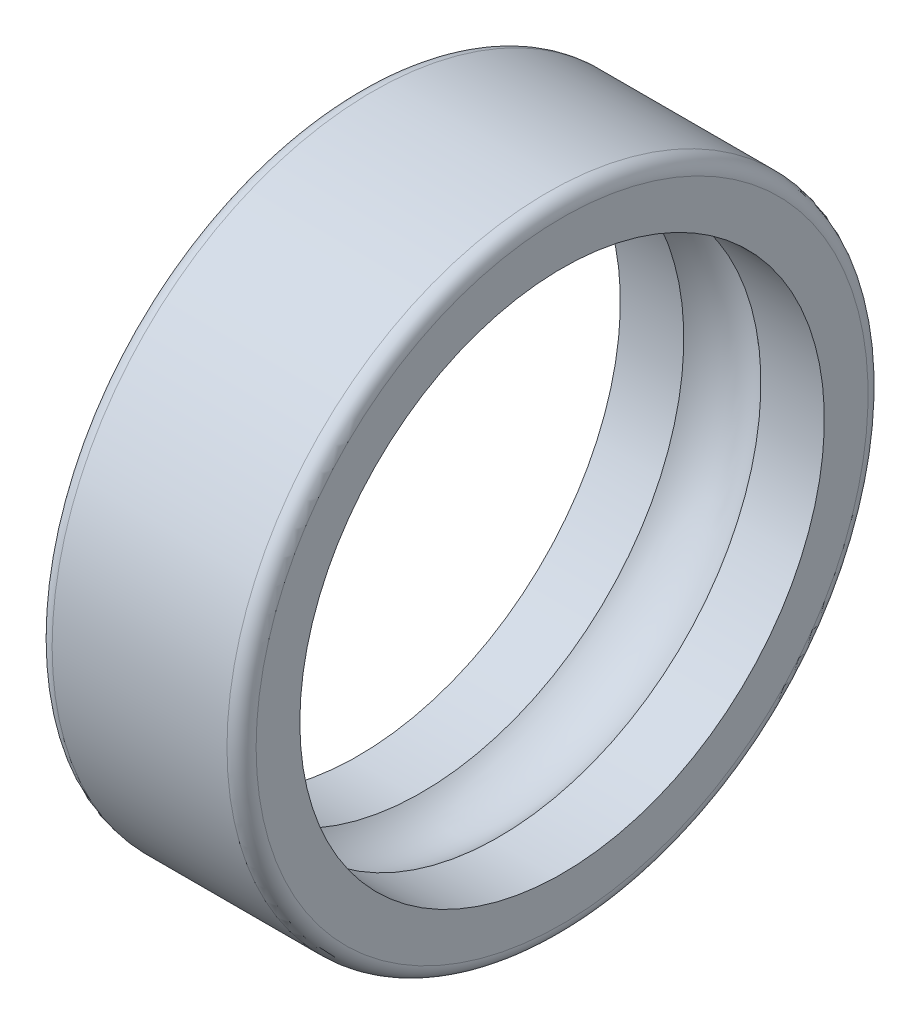
ISO-10303-21;
HEADER;
FILE_DESCRIPTION(('STEP AP214'),'2;1');
FILE_NAME('part.step','',(''),(''),'','','');
FILE_SCHEMA(('AUTOMOTIVE_DESIGN { 1 0 10303 214 1 1 1 1 }'));
ENDSEC;
DATA;
#1=APPLICATION_CONTEXT('core data for automotive mechanical design processes');
#2=APPLICATION_PROTOCOL_DEFINITION('international standard','automotive_design',2000,#1);
#3=PRODUCT_CONTEXT('',#1,'mechanical');
#4=PRODUCT('Part','Part','',(#3));
#5=PRODUCT_RELATED_PRODUCT_CATEGORY('part','',(#4));
#6=PRODUCT_DEFINITION_FORMATION('','',#4);
#7=PRODUCT_DEFINITION_CONTEXT('part definition',#1,'design');
#8=PRODUCT_DEFINITION('design','',#6,#7);
#9=PRODUCT_DEFINITION_SHAPE('','',#8);
#10=(LENGTH_UNIT() NAMED_UNIT(*) SI_UNIT(.MILLI.,.METRE.));
#11=(NAMED_UNIT(*) PLANE_ANGLE_UNIT() SI_UNIT($,.RADIAN.));
#12=(NAMED_UNIT(*) SI_UNIT($,.STERADIAN.) SOLID_ANGLE_UNIT());
#13=UNCERTAINTY_MEASURE_WITH_UNIT(LENGTH_MEASURE(1.E-05),#10,'distance_accuracy_value','');
#14=(GEOMETRIC_REPRESENTATION_CONTEXT(3) GLOBAL_UNCERTAINTY_ASSIGNED_CONTEXT((#13)) GLOBAL_UNIT_ASSIGNED_CONTEXT((#10,
#11,#12)) REPRESENTATION_CONTEXT('',''));
#15=CARTESIAN_POINT('',(0.,0.,0.));
#16=DIRECTION('',(0.,0.,1.));
#17=DIRECTION('',(1.,0.,0.));
#18=AXIS2_PLACEMENT_3D('',#15,#16,#17);
#19=CARTESIAN_POINT('',(0.,0.,0.));
#20=DIRECTION('',(-1.,0.,0.));
#21=DIRECTION('',(0.,0.,1.));
#22=AXIS2_PLACEMENT_3D('',#19,#20,#21);
#23=CYLINDRICAL_SURFACE('',#22,9.);
#24=CARTESIAN_POINT('',(3.5,0.,0.));
#25=DIRECTION('',(-1.,0.,0.));
#26=DIRECTION('',(0.,0.,1.));
#27=AXIS2_PLACEMENT_3D('',#24,#25,#26);
#28=CIRCLE('',#27,9.);
#29=CARTESIAN_POINT('',(3.5,0.,9.));
#30=VERTEX_POINT('',#29);
#31=EDGE_CURVE('E376',#30,#30,#28,.T.);
#32=ORIENTED_EDGE('',*,*,#31,.F.);
#33=EDGE_LOOP('',(#32));
#34=FACE_BOUND('',#33,.T.);
#35=CARTESIAN_POINT('',(1.3228756555323,0.,0.));
#36=DIRECTION('',(-1.,0.,0.));
#37=DIRECTION('',(0.,0.,1.));
#38=AXIS2_PLACEMENT_3D('',#35,#36,#37);
#39=CIRCLE('',#38,9.);
#40=CARTESIAN_POINT('',(1.3228756555323,0.,9.));
#41=VERTEX_POINT('',#40);
#42=EDGE_CURVE('E10',#41,#41,#39,.T.);
#43=ORIENTED_EDGE('',*,*,#42,.T.);
#44=EDGE_LOOP('',(#43));
#45=FACE_BOUND('',#44,.T.);
#46=ADVANCED_FACE('F348',(#34,#45),#23,.F.);
#47=CARTESIAN_POINT('',(0.,0.,0.));
#48=DIRECTION('',(-1.,0.,0.));
#49=DIRECTION('',(0.,0.,1.));
#50=AXIS2_PLACEMENT_3D('',#47,#48,#49);
#51=TOROIDAL_SURFACE('',#50,7.5,2.);
#52=ORIENTED_EDGE('',*,*,#42,.F.);
#53=EDGE_LOOP('',(#52));
#54=FACE_BOUND('',#53,.T.);
#55=CARTESIAN_POINT('',(-1.3228756555323,0.,0.));
#56=DIRECTION('',(-1.,0.,0.));
#57=DIRECTION('',(0.,0.,1.));
#58=AXIS2_PLACEMENT_3D('',#55,#56,#57);
#59=CIRCLE('',#58,9.);
#60=CARTESIAN_POINT('',(-1.3228756555323,0.,9.));
#61=VERTEX_POINT('',#60);
#62=EDGE_CURVE('E354',#61,#61,#59,.T.);
#63=ORIENTED_EDGE('',*,*,#62,.T.);
#64=EDGE_LOOP('',(#63));
#65=FACE_BOUND('',#64,.T.);
#66=ADVANCED_FACE('F383',(#54,#65),#51,.F.);
#67=CARTESIAN_POINT('',(0.,0.,0.));
#68=DIRECTION('',(-1.,0.,0.));
#69=DIRECTION('',(0.,0.,1.));
#70=AXIS2_PLACEMENT_3D('',#67,#68,#69);
#71=CYLINDRICAL_SURFACE('',#70,9.);
#72=ORIENTED_EDGE('',*,*,#62,.F.);
#73=EDGE_LOOP('',(#72));
#74=FACE_BOUND('',#73,.T.);
#75=CARTESIAN_POINT('',(-3.5,0.,0.));
#76=DIRECTION('',(-1.,0.,0.));
#77=DIRECTION('',(0.,0.,1.));
#78=AXIS2_PLACEMENT_3D('',#75,#76,#77);
#79=CIRCLE('',#78,9.);
#80=CARTESIAN_POINT('',(-3.5,0.,9.));
#81=VERTEX_POINT('',#80);
#82=EDGE_CURVE('E358',#81,#81,#79,.T.);
#83=ORIENTED_EDGE('',*,*,#82,.T.);
#84=EDGE_LOOP('',(#83));
#85=FACE_BOUND('',#84,.T.);
#86=ADVANCED_FACE('F387',(#74,#85),#71,.F.);
#87=CARTESIAN_POINT('',(-3.5,10.5,0.));
#88=DIRECTION('',(1.,0.,0.));
#89=DIRECTION('',(0.,0.,-1.));
#90=AXIS2_PLACEMENT_3D('',#87,#88,#89);
#91=PLANE('',#90);
#92=ORIENTED_EDGE('',*,*,#82,.F.);
#93=EDGE_LOOP('',(#92));
#94=FACE_BOUND('',#93,.T.);
#95=CARTESIAN_POINT('',(-3.5,0.,0.));
#96=DIRECTION('',(-1.,0.,0.));
#97=DIRECTION('',(0.,0.,1.));
#98=AXIS2_PLACEMENT_3D('',#95,#96,#97);
#99=CIRCLE('',#98,10.5);
#100=CARTESIAN_POINT('',(-3.5,0.,10.5));
#101=VERTEX_POINT('',#100);
#102=EDGE_CURVE('E362',#101,#101,#99,.T.);
#103=ORIENTED_EDGE('',*,*,#102,.T.);
#104=EDGE_LOOP('',(#103));
#105=FACE_BOUND('',#104,.T.);
#106=ADVANCED_FACE('F392',(#94,#105),#91,.F.);
#107=CARTESIAN_POINT('',(-3.,0.,0.));
#108=DIRECTION('',(-1.,0.,0.));
#109=DIRECTION('',(0.,0.,1.));
#110=AXIS2_PLACEMENT_3D('',#107,#108,#109);
#111=TOROIDAL_SURFACE('',#110,10.5,0.499999999999999);
#112=ORIENTED_EDGE('',*,*,#102,.F.);
#113=EDGE_LOOP('',(#112));
#114=FACE_BOUND('',#113,.T.);
#115=CARTESIAN_POINT('',(-3.,0.,0.));
#116=DIRECTION('',(-1.,0.,0.));
#117=DIRECTION('',(0.,0.,1.));
#118=AXIS2_PLACEMENT_3D('',#115,#116,#117);
#119=CIRCLE('',#118,11.);
#120=CARTESIAN_POINT('',(-3.,0.,11.));
#121=VERTEX_POINT('',#120);
#122=EDGE_CURVE('E367',#121,#121,#119,.T.);
#123=ORIENTED_EDGE('',*,*,#122,.T.);
#124=EDGE_LOOP('',(#123));
#125=FACE_BOUND('',#124,.T.);
#126=ADVANCED_FACE('F398',(#114,#125),#111,.T.);
#127=CARTESIAN_POINT('',(0.,0.,0.));
#128=DIRECTION('',(-1.,0.,0.));
#129=DIRECTION('',(0.,0.,1.));
#130=AXIS2_PLACEMENT_3D('',#127,#128,#129);
#131=CYLINDRICAL_SURFACE('',#130,11.);
#132=ORIENTED_EDGE('',*,*,#122,.F.);
#133=EDGE_LOOP('',(#132));
#134=FACE_BOUND('',#133,.T.);
#135=CARTESIAN_POINT('',(3.,0.,0.));
#136=DIRECTION('',(-1.,0.,0.));
#137=DIRECTION('',(0.,0.,1.));
#138=AXIS2_PLACEMENT_3D('',#135,#136,#137);
#139=CIRCLE('',#138,11.);
#140=CARTESIAN_POINT('',(3.,0.,11.));
#141=VERTEX_POINT('',#140);
#142=EDGE_CURVE('E370',#141,#141,#139,.T.);
#143=ORIENTED_EDGE('',*,*,#142,.T.);
#144=EDGE_LOOP('',(#143));
#145=FACE_BOUND('',#144,.T.);
#146=ADVANCED_FACE('F402',(#134,#145),#131,.T.);
#147=CARTESIAN_POINT('',(3.,0.,0.));
#148=DIRECTION('',(-1.,0.,0.));
#149=DIRECTION('',(0.,0.,1.));
#150=AXIS2_PLACEMENT_3D('',#147,#148,#149);
#151=TOROIDAL_SURFACE('',#150,10.5,0.499999999999999);
#152=ORIENTED_EDGE('',*,*,#142,.F.);
#153=EDGE_LOOP('',(#152));
#154=FACE_BOUND('',#153,.T.);
#155=CARTESIAN_POINT('',(3.5,0.,0.));
#156=DIRECTION('',(-1.,0.,0.));
#157=DIRECTION('',(0.,0.,1.));
#158=AXIS2_PLACEMENT_3D('',#155,#156,#157);
#159=CIRCLE('',#158,10.5);
#160=CARTESIAN_POINT('',(3.5,0.,10.5));
#161=VERTEX_POINT('',#160);
#162=EDGE_CURVE('E373',#161,#161,#159,.T.);
#163=ORIENTED_EDGE('',*,*,#162,.T.);
#164=EDGE_LOOP('',(#163));
#165=FACE_BOUND('',#164,.T.);
#166=ADVANCED_FACE('F406',(#154,#165),#151,.T.);
#167=CARTESIAN_POINT('',(3.5,10.5,0.));
#168=DIRECTION('',(-1.,0.,0.));
#169=DIRECTION('',(0.,0.,1.));
#170=AXIS2_PLACEMENT_3D('',#167,#168,#169);
#171=PLANE('',#170);
#172=ORIENTED_EDGE('',*,*,#162,.F.);
#173=EDGE_LOOP('',(#172));
#174=FACE_BOUND('',#173,.T.);
#175=ORIENTED_EDGE('',*,*,#31,.T.);
#176=EDGE_LOOP('',(#175));
#177=FACE_BOUND('',#176,.T.);
#178=ADVANCED_FACE('F380',(#174,#177),#171,.F.);
#179=CLOSED_SHELL('',(#46,#66,#86,#106,#126,#146,#166,#178));
#180=MANIFOLD_SOLID_BREP('B2',#179);
#181=ADVANCED_BREP_SHAPE_REPRESENTATION('',(#18,#180),#14);
#182=SHAPE_DEFINITION_REPRESENTATION(#9,#181);
ENDSEC;
END-ISO-10303-21;
